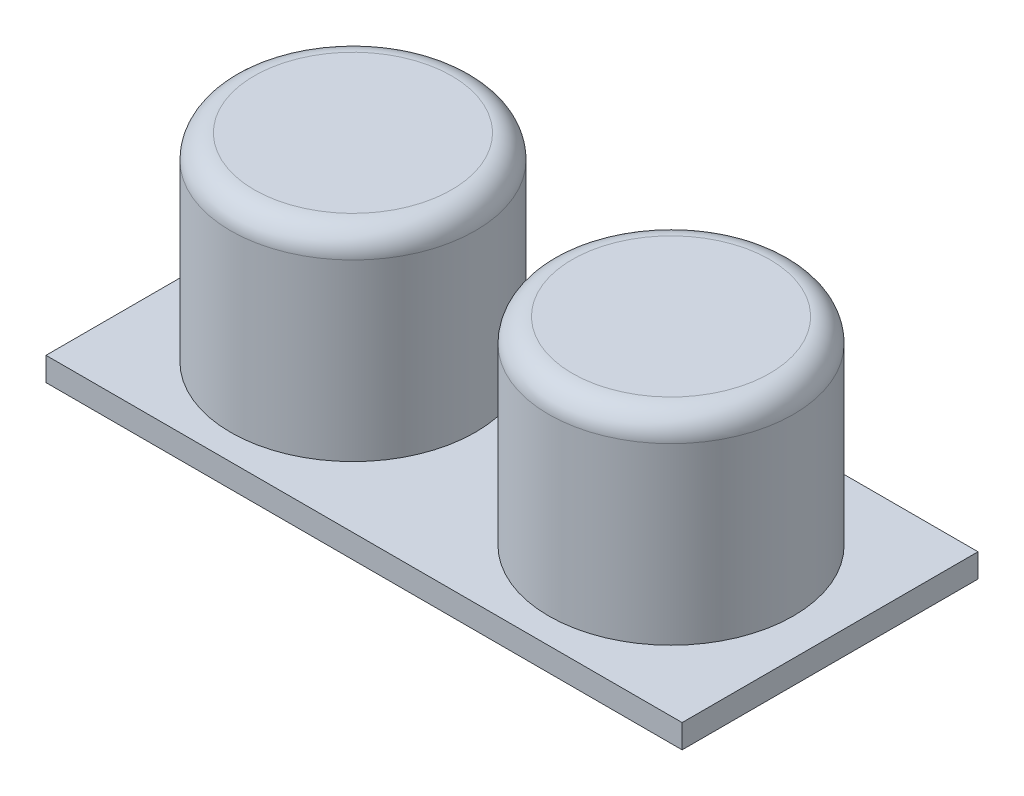
ISO-10303-21;
HEADER;
FILE_DESCRIPTION(('STEP AP214'),'2;1');
FILE_NAME('part.step','',(''),(''),'','','');
FILE_SCHEMA(('AUTOMOTIVE_DESIGN { 1 0 10303 214 1 1 1 1 }'));
ENDSEC;
DATA;
#1=APPLICATION_CONTEXT('core data for automotive mechanical design processes');
#2=APPLICATION_PROTOCOL_DEFINITION('international standard','automotive_design',2000,#1);
#3=PRODUCT_CONTEXT('',#1,'mechanical');
#4=PRODUCT('Part','Part','',(#3));
#5=PRODUCT_RELATED_PRODUCT_CATEGORY('part','',(#4));
#6=PRODUCT_DEFINITION_FORMATION('','',#4);
#7=PRODUCT_DEFINITION_CONTEXT('part definition',#1,'design');
#8=PRODUCT_DEFINITION('design','',#6,#7);
#9=PRODUCT_DEFINITION_SHAPE('','',#8);
#10=(LENGTH_UNIT() NAMED_UNIT(*) SI_UNIT(.MILLI.,.METRE.));
#11=(NAMED_UNIT(*) PLANE_ANGLE_UNIT() SI_UNIT($,.RADIAN.));
#12=(NAMED_UNIT(*) SI_UNIT($,.STERADIAN.) SOLID_ANGLE_UNIT());
#13=UNCERTAINTY_MEASURE_WITH_UNIT(LENGTH_MEASURE(1.E-05),#10,'distance_accuracy_value','');
#14=(GEOMETRIC_REPRESENTATION_CONTEXT(3) GLOBAL_UNCERTAINTY_ASSIGNED_CONTEXT((#13)) GLOBAL_UNIT_ASSIGNED_CONTEXT((#10,
#11,#12)) REPRESENTATION_CONTEXT('',''));
#15=CARTESIAN_POINT('',(0.,0.,0.));
#16=DIRECTION('',(0.,0.,1.));
#17=DIRECTION('',(1.,0.,0.));
#18=AXIS2_PLACEMENT_3D('',#15,#16,#17);
#19=CARTESIAN_POINT('',(0.,0.,0.));
#20=DIRECTION('',(0.,-1.,0.));
#21=DIRECTION('',(0.,0.,-1.));
#22=AXIS2_PLACEMENT_3D('',#19,#20,#21);
#23=PLANE('',#22);
#24=DIRECTION('',(-1.,0.,0.));
#25=VECTOR('',#24,1.);
#26=CARTESIAN_POINT('',(21.5,0.,10.));
#27=LINE('',#26,#25);
#28=CARTESIAN_POINT('',(21.5,0.,10.));
#29=VERTEX_POINT('',#28);
#30=CARTESIAN_POINT('',(-21.5,0.,10.));
#31=VERTEX_POINT('',#30);
#32=EDGE_CURVE('E122',#29,#31,#27,.T.);
#33=ORIENTED_EDGE('',*,*,#32,.T.);
#34=DIRECTION('',(0.,0.,-1.));
#35=VECTOR('',#34,1.);
#36=CARTESIAN_POINT('',(-21.5,0.,10.));
#37=LINE('',#36,#35);
#38=CARTESIAN_POINT('',(-21.5,0.,-10.));
#39=VERTEX_POINT('',#38);
#40=EDGE_CURVE('E125',#31,#39,#37,.T.);
#41=ORIENTED_EDGE('',*,*,#40,.T.);
#42=DIRECTION('',(-1.,0.,0.));
#43=VECTOR('',#42,1.);
#44=CARTESIAN_POINT('',(21.5,0.,-10.));
#45=LINE('',#44,#43);
#46=CARTESIAN_POINT('',(21.5,0.,-10.));
#47=VERTEX_POINT('',#46);
#48=EDGE_CURVE('E145',#47,#39,#45,.T.);
#49=ORIENTED_EDGE('',*,*,#48,.F.);
#50=DIRECTION('',(0.,0.,-1.));
#51=VECTOR('',#50,1.);
#52=CARTESIAN_POINT('',(21.5,0.,10.));
#53=LINE('',#52,#51);
#54=EDGE_CURVE('E135',#29,#47,#53,.T.);
#55=ORIENTED_EDGE('',*,*,#54,.F.);
#56=EDGE_LOOP('',(#33,#41,#49,#55));
#57=FACE_BOUND('',#56,.T.);
#58=DIRECTION('',(-1.,0.,0.));
#59=VECTOR('',#58,1.);
#60=CARTESIAN_POINT('',(3.81,0.,-7.3248809899986));
#61=LINE('',#60,#59);
#62=CARTESIAN_POINT('',(3.81,0.,-7.3248809899986));
#63=VERTEX_POINT('',#62);
#64=CARTESIAN_POINT('',(-6.35,0.,-7.3248809899986));
#65=VERTEX_POINT('',#64);
#66=EDGE_CURVE('E50',#63,#65,#61,.T.);
#67=ORIENTED_EDGE('',*,*,#66,.F.);
#68=DIRECTION('',(0.,0.,1.));
#69=VECTOR('',#68,1.);
#70=CARTESIAN_POINT('',(3.81,0.,-9.8648809899986));
#71=LINE('',#70,#69);
#72=CARTESIAN_POINT('',(3.81,0.,-9.8648809899986));
#73=VERTEX_POINT('',#72);
#74=EDGE_CURVE('E121',#73,#63,#71,.T.);
#75=ORIENTED_EDGE('',*,*,#74,.F.);
#76=DIRECTION('',(-1.,0.,0.));
#77=VECTOR('',#76,1.);
#78=CARTESIAN_POINT('',(3.81,0.,-9.8648809899986));
#79=LINE('',#78,#77);
#80=CARTESIAN_POINT('',(-6.35,0.,-9.86488098999861));
#81=VERTEX_POINT('',#80);
#82=EDGE_CURVE('E118',#73,#81,#79,.T.);
#83=ORIENTED_EDGE('',*,*,#82,.T.);
#84=DIRECTION('',(0.,0.,1.));
#85=VECTOR('',#84,1.);
#86=CARTESIAN_POINT('',(-6.35,0.,-9.86488098999861));
#87=LINE('',#86,#85);
#88=EDGE_CURVE('E55',#81,#65,#87,.T.);
#89=ORIENTED_EDGE('',*,*,#88,.T.);
#90=EDGE_LOOP('',(#67,#75,#83,#89));
#91=FACE_BOUND('',#90,.T.);
#92=ADVANCED_FACE('F35',(#57,#91),#23,.T.);
#93=CARTESIAN_POINT('',(21.5,1.6,10.));
#94=DIRECTION('',(0.,0.,1.));
#95=DIRECTION('',(1.,0.,0.));
#96=AXIS2_PLACEMENT_3D('',#93,#94,#95);
#97=PLANE('',#96);
#98=ORIENTED_EDGE('',*,*,#32,.F.);
#99=DIRECTION('',(0.,-1.,0.));
#100=VECTOR('',#99,1.);
#101=CARTESIAN_POINT('',(21.5,1.6,10.));
#102=LINE('',#101,#100);
#103=CARTESIAN_POINT('',(21.5,1.6,10.));
#104=VERTEX_POINT('',#103);
#105=EDGE_CURVE('E149',#104,#29,#102,.T.);
#106=ORIENTED_EDGE('',*,*,#105,.F.);
#107=DIRECTION('',(-1.,0.,0.));
#108=VECTOR('',#107,1.);
#109=CARTESIAN_POINT('',(21.5,1.6,10.));
#110=LINE('',#109,#108);
#111=CARTESIAN_POINT('',(-21.5,1.6,10.));
#112=VERTEX_POINT('',#111);
#113=EDGE_CURVE('E131',#104,#112,#110,.T.);
#114=ORIENTED_EDGE('',*,*,#113,.T.);
#115=DIRECTION('',(0.,-1.,0.));
#116=VECTOR('',#115,1.);
#117=CARTESIAN_POINT('',(-21.5,1.6,10.));
#118=LINE('',#117,#116);
#119=EDGE_CURVE('E141',#112,#31,#118,.T.);
#120=ORIENTED_EDGE('',*,*,#119,.T.);
#121=EDGE_LOOP('',(#98,#106,#114,#120));
#122=FACE_BOUND('',#121,.T.);
#123=ADVANCED_FACE('F184',(#122),#97,.T.);
#124=CARTESIAN_POINT('',(21.5,1.6,10.));
#125=DIRECTION('',(-1.,0.,0.));
#126=DIRECTION('',(0.,0.,1.));
#127=AXIS2_PLACEMENT_3D('',#124,#125,#126);
#128=PLANE('',#127);
#129=ORIENTED_EDGE('',*,*,#54,.T.);
#130=DIRECTION('',(0.,-1.,0.));
#131=VECTOR('',#130,1.);
#132=CARTESIAN_POINT('',(21.5,1.6,-10.));
#133=LINE('',#132,#131);
#134=CARTESIAN_POINT('',(21.5,1.6,-10.));
#135=VERTEX_POINT('',#134);
#136=EDGE_CURVE('E152',#135,#47,#133,.T.);
#137=ORIENTED_EDGE('',*,*,#136,.F.);
#138=DIRECTION('',(0.,0.,-1.));
#139=VECTOR('',#138,1.);
#140=CARTESIAN_POINT('',(21.5,1.6,10.));
#141=LINE('',#140,#139);
#142=EDGE_CURVE('E140',#104,#135,#141,.T.);
#143=ORIENTED_EDGE('',*,*,#142,.F.);
#144=ORIENTED_EDGE('',*,*,#105,.T.);
#145=EDGE_LOOP('',(#129,#137,#143,#144));
#146=FACE_BOUND('',#145,.T.);
#147=ADVANCED_FACE('F190',(#146),#128,.F.);
#148=CARTESIAN_POINT('',(21.5,1.6,-10.));
#149=DIRECTION('',(0.,0.,1.));
#150=DIRECTION('',(1.,0.,0.));
#151=AXIS2_PLACEMENT_3D('',#148,#149,#150);
#152=PLANE('',#151);
#153=ORIENTED_EDGE('',*,*,#48,.T.);
#154=DIRECTION('',(0.,-1.,0.));
#155=VECTOR('',#154,1.);
#156=CARTESIAN_POINT('',(-21.5,1.6,-10.));
#157=LINE('',#156,#155);
#158=CARTESIAN_POINT('',(-21.5,1.6,-10.));
#159=VERTEX_POINT('',#158);
#160=EDGE_CURVE('E155',#159,#39,#157,.T.);
#161=ORIENTED_EDGE('',*,*,#160,.F.);
#162=DIRECTION('',(-1.,0.,0.));
#163=VECTOR('',#162,1.);
#164=CARTESIAN_POINT('',(21.5,1.6,-10.));
#165=LINE('',#164,#163);
#166=EDGE_CURVE('E138',#135,#159,#165,.T.);
#167=ORIENTED_EDGE('',*,*,#166,.F.);
#168=ORIENTED_EDGE('',*,*,#136,.T.);
#169=EDGE_LOOP('',(#153,#161,#167,#168));
#170=FACE_BOUND('',#169,.T.);
#171=ADVANCED_FACE('F199',(#170),#152,.F.);
#172=CARTESIAN_POINT('',(-21.5,1.6,10.));
#173=DIRECTION('',(-1.,0.,0.));
#174=DIRECTION('',(0.,0.,1.));
#175=AXIS2_PLACEMENT_3D('',#172,#173,#174);
#176=PLANE('',#175);
#177=ORIENTED_EDGE('',*,*,#40,.F.);
#178=ORIENTED_EDGE('',*,*,#119,.F.);
#179=DIRECTION('',(0.,0.,-1.));
#180=VECTOR('',#179,1.);
#181=CARTESIAN_POINT('',(-21.5,1.6,10.));
#182=LINE('',#181,#180);
#183=EDGE_CURVE('E134',#112,#159,#182,.T.);
#184=ORIENTED_EDGE('',*,*,#183,.T.);
#185=ORIENTED_EDGE('',*,*,#160,.T.);
#186=EDGE_LOOP('',(#177,#178,#184,#185));
#187=FACE_BOUND('',#186,.T.);
#188=ADVANCED_FACE('F203',(#187),#176,.T.);
#189=CARTESIAN_POINT('',(0.,1.6,0.));
#190=DIRECTION('',(0.,-1.,0.));
#191=DIRECTION('',(0.,0.,-1.));
#192=AXIS2_PLACEMENT_3D('',#189,#190,#191);
#193=PLANE('',#192);
#194=CARTESIAN_POINT('',(10.75,1.6,0.));
#195=DIRECTION('',(0.,-1.,0.));
#196=DIRECTION('',(0.,0.,-1.));
#197=AXIS2_PLACEMENT_3D('',#194,#195,#196);
#198=CIRCLE('',#197,8.27293005142715);
#199=CARTESIAN_POINT('',(10.75,1.6,-8.27293005142715));
#200=VERTEX_POINT('',#199);
#201=EDGE_CURVE('E160',#200,#200,#198,.F.);
#202=ORIENTED_EDGE('',*,*,#201,.F.);
#203=EDGE_LOOP('',(#202));
#204=FACE_BOUND('',#203,.T.);
#205=CARTESIAN_POINT('',(-10.75,1.6,0.));
#206=DIRECTION('',(0.,-1.,0.));
#207=DIRECTION('',(0.,0.,-1.));
#208=AXIS2_PLACEMENT_3D('',#205,#206,#207);
#209=CIRCLE('',#208,8.27293005142715);
#210=CARTESIAN_POINT('',(-10.75,1.6,-8.27293005142715));
#211=VERTEX_POINT('',#210);
#212=EDGE_CURVE('E151',#211,#211,#209,.F.);
#213=ORIENTED_EDGE('',*,*,#212,.F.);
#214=EDGE_LOOP('',(#213));
#215=FACE_BOUND('',#214,.T.);
#216=ORIENTED_EDGE('',*,*,#113,.F.);
#217=ORIENTED_EDGE('',*,*,#142,.T.);
#218=ORIENTED_EDGE('',*,*,#166,.T.);
#219=ORIENTED_EDGE('',*,*,#183,.F.);
#220=EDGE_LOOP('',(#216,#217,#218,#219));
#221=FACE_BOUND('',#220,.T.);
#222=ADVANCED_FACE('F195',(#204,#215,#221),#193,.F.);
#223=CARTESIAN_POINT('',(-10.75,15.,0.));
#224=DIRECTION('',(0.,-1.,0.));
#225=DIRECTION('',(0.,0.,-1.));
#226=AXIS2_PLACEMENT_3D('',#223,#224,#225);
#227=CYLINDRICAL_SURFACE('',#226,8.27293005142715);
#228=CARTESIAN_POINT('',(-10.75,13.4,0.));
#229=DIRECTION('',(0.,1.,0.));
#230=DIRECTION('',(0.,0.,1.));
#231=AXIS2_PLACEMENT_3D('',#228,#229,#230);
#232=CIRCLE('',#231,8.27293005142715);
#233=CARTESIAN_POINT('',(-10.75,13.4,8.27293005142715));
#234=VERTEX_POINT('',#233);
#235=EDGE_CURVE('E166',#234,#234,#232,.F.);
#236=ORIENTED_EDGE('',*,*,#235,.T.);
#237=EDGE_LOOP('',(#236));
#238=FACE_BOUND('',#237,.T.);
#239=ORIENTED_EDGE('',*,*,#212,.T.);
#240=EDGE_LOOP('',(#239));
#241=FACE_BOUND('',#240,.T.);
#242=ADVANCED_FACE('F210',(#238,#241),#227,.T.);
#243=CARTESIAN_POINT('',(-10.75,15.,0.));
#244=DIRECTION('',(0.,1.,0.));
#245=DIRECTION('',(0.,0.,1.));
#246=AXIS2_PLACEMENT_3D('',#243,#244,#245);
#247=PLANE('',#246);
#248=CARTESIAN_POINT('',(-10.75,15.,0.));
#249=DIRECTION('',(0.,1.,0.));
#250=DIRECTION('',(0.,0.,1.));
#251=AXIS2_PLACEMENT_3D('',#248,#249,#250);
#252=CIRCLE('',#251,6.67293005142715);
#253=CARTESIAN_POINT('',(-10.75,15.,6.67293005142715));
#254=VERTEX_POINT('',#253);
#255=EDGE_CURVE('E163',#254,#254,#252,.T.);
#256=ORIENTED_EDGE('',*,*,#255,.T.);
#257=EDGE_LOOP('',(#256));
#258=FACE_BOUND('',#257,.T.);
#259=ADVANCED_FACE('F226',(#258),#247,.T.);
#260=CARTESIAN_POINT('',(10.75,15.,0.));
#261=DIRECTION('',(0.,-1.,0.));
#262=DIRECTION('',(0.,0.,-1.));
#263=AXIS2_PLACEMENT_3D('',#260,#261,#262);
#264=CYLINDRICAL_SURFACE('',#263,8.27293005142715);
#265=CARTESIAN_POINT('',(10.75,13.4,0.));
#266=DIRECTION('',(0.,-1.,0.));
#267=DIRECTION('',(0.,0.,-1.));
#268=AXIS2_PLACEMENT_3D('',#265,#266,#267);
#269=CIRCLE('',#268,8.27293005142715);
#270=CARTESIAN_POINT('',(10.75,13.4,-8.27293005142715));
#271=VERTEX_POINT('',#270);
#272=EDGE_CURVE('E11',#271,#271,#269,.T.);
#273=ORIENTED_EDGE('',*,*,#272,.T.);
#274=EDGE_LOOP('',(#273));
#275=FACE_BOUND('',#274,.T.);
#276=ORIENTED_EDGE('',*,*,#201,.T.);
#277=EDGE_LOOP('',(#276));
#278=FACE_BOUND('',#277,.T.);
#279=ADVANCED_FACE('F233',(#275,#278),#264,.T.);
#280=CARTESIAN_POINT('',(10.75,15.,0.));
#281=DIRECTION('',(0.,-1.,0.));
#282=DIRECTION('',(0.,0.,-1.));
#283=AXIS2_PLACEMENT_3D('',#280,#281,#282);
#284=PLANE('',#283);
#285=CARTESIAN_POINT('',(10.75,15.,0.));
#286=DIRECTION('',(0.,-1.,0.));
#287=DIRECTION('',(0.,0.,-1.));
#288=AXIS2_PLACEMENT_3D('',#285,#286,#287);
#289=CIRCLE('',#288,6.67293005142715);
#290=CARTESIAN_POINT('',(10.75,15.,-6.67293005142715));
#291=VERTEX_POINT('',#290);
#292=EDGE_CURVE('E43',#291,#291,#289,.F.);
#293=ORIENTED_EDGE('',*,*,#292,.T.);
#294=EDGE_LOOP('',(#293));
#295=FACE_BOUND('',#294,.T.);
#296=ADVANCED_FACE('F171',(#295),#284,.F.);
#297=CARTESIAN_POINT('',(-10.75,13.4,0.));
#298=DIRECTION('',(0.,1.,0.));
#299=DIRECTION('',(0.,0.,1.));
#300=AXIS2_PLACEMENT_3D('',#297,#298,#299);
#301=TOROIDAL_SURFACE('',#300,6.67293005142715,1.6);
#302=ORIENTED_EDGE('',*,*,#235,.F.);
#303=EDGE_LOOP('',(#302));
#304=FACE_BOUND('',#303,.T.);
#305=ORIENTED_EDGE('',*,*,#255,.F.);
#306=EDGE_LOOP('',(#305));
#307=FACE_BOUND('',#306,.T.);
#308=ADVANCED_FACE('F174',(#304,#307),#301,.T.);
#309=CARTESIAN_POINT('',(10.75,13.4,0.));
#310=DIRECTION('',(0.,-1.,0.));
#311=DIRECTION('',(0.,0.,-1.));
#312=AXIS2_PLACEMENT_3D('',#309,#310,#311);
#313=TOROIDAL_SURFACE('',#312,6.67293005142715,1.6);
#314=ORIENTED_EDGE('',*,*,#272,.F.);
#315=EDGE_LOOP('',(#314));
#316=FACE_BOUND('',#315,.T.);
#317=ORIENTED_EDGE('',*,*,#292,.F.);
#318=EDGE_LOOP('',(#317));
#319=FACE_BOUND('',#318,.T.);
#320=ADVANCED_FACE('F37',(#316,#319),#313,.T.);
#321=CARTESIAN_POINT('',(3.81,-1.6,-9.8648809899986));
#322=DIRECTION('',(-1.,0.,0.));
#323=DIRECTION('',(0.,0.,1.));
#324=AXIS2_PLACEMENT_3D('',#321,#322,#323);
#325=PLANE('',#324);
#326=ORIENTED_EDGE('',*,*,#74,.T.);
#327=DIRECTION('',(0.,1.,0.));
#328=VECTOR('',#327,1.);
#329=CARTESIAN_POINT('',(3.81,-1.6,-7.3248809899986));
#330=LINE('',#329,#328);
#331=CARTESIAN_POINT('',(3.81,-1.6,-7.3248809899986));
#332=VERTEX_POINT('',#331);
#333=EDGE_CURVE('E102',#332,#63,#330,.T.);
#334=ORIENTED_EDGE('',*,*,#333,.F.);
#335=DIRECTION('',(0.,0.,1.));
#336=VECTOR('',#335,1.);
#337=CARTESIAN_POINT('',(3.81,-1.6,-9.8648809899986));
#338=LINE('',#337,#336);
#339=CARTESIAN_POINT('',(3.81,-1.6,-9.8648809899986));
#340=VERTEX_POINT('',#339);
#341=EDGE_CURVE('E109',#340,#332,#338,.T.);
#342=ORIENTED_EDGE('',*,*,#341,.F.);
#343=DIRECTION('',(0.,1.,0.));
#344=VECTOR('',#343,1.);
#345=CARTESIAN_POINT('',(3.81,-1.6,-9.8648809899986));
#346=LINE('',#345,#344);
#347=EDGE_CURVE('E350',#340,#73,#346,.T.);
#348=ORIENTED_EDGE('',*,*,#347,.T.);
#349=EDGE_LOOP('',(#326,#334,#342,#348));
#350=FACE_BOUND('',#349,.T.);
#351=ADVANCED_FACE('F120',(#350),#325,.F.);
#352=CARTESIAN_POINT('',(3.81,-1.6,-7.3248809899986));
#353=DIRECTION('',(0.,0.,-1.));
#354=DIRECTION('',(-1.,0.,0.));
#355=AXIS2_PLACEMENT_3D('',#352,#353,#354);
#356=PLANE('',#355);
#357=ORIENTED_EDGE('',*,*,#66,.T.);
#358=DIRECTION('',(0.,1.,0.));
#359=VECTOR('',#358,1.);
#360=CARTESIAN_POINT('',(-6.35,-1.6,-7.3248809899986));
#361=LINE('',#360,#359);
#362=CARTESIAN_POINT('',(-6.35,-1.6,-7.3248809899986));
#363=VERTEX_POINT('',#362);
#364=EDGE_CURVE('E104',#363,#65,#361,.T.);
#365=ORIENTED_EDGE('',*,*,#364,.F.);
#366=DIRECTION('',(-1.,0.,0.));
#367=VECTOR('',#366,1.);
#368=CARTESIAN_POINT('',(3.81,-1.6,-7.3248809899986));
#369=LINE('',#368,#367);
#370=EDGE_CURVE('E98',#332,#363,#369,.T.);
#371=ORIENTED_EDGE('',*,*,#370,.F.);
#372=ORIENTED_EDGE('',*,*,#333,.T.);
#373=EDGE_LOOP('',(#357,#365,#371,#372));
#374=FACE_BOUND('',#373,.T.);
#375=ADVANCED_FACE('F100',(#374),#356,.F.);
#376=CARTESIAN_POINT('',(-6.35,-1.6,-9.86488098999861));
#377=DIRECTION('',(-1.,0.,0.));
#378=DIRECTION('',(0.,0.,1.));
#379=AXIS2_PLACEMENT_3D('',#376,#377,#378);
#380=PLANE('',#379);
#381=ORIENTED_EDGE('',*,*,#88,.F.);
#382=DIRECTION('',(0.,1.,0.));
#383=VECTOR('',#382,1.);
#384=CARTESIAN_POINT('',(-6.35,-1.6,-9.86488098999861));
#385=LINE('',#384,#383);
#386=CARTESIAN_POINT('',(-6.35,-1.6,-9.86488098999861));
#387=VERTEX_POINT('',#386);
#388=EDGE_CURVE('E127',#387,#81,#385,.T.);
#389=ORIENTED_EDGE('',*,*,#388,.F.);
#390=DIRECTION('',(0.,0.,1.));
#391=VECTOR('',#390,1.);
#392=CARTESIAN_POINT('',(-6.35,-1.6,-9.86488098999861));
#393=LINE('',#392,#391);
#394=EDGE_CURVE('E108',#387,#363,#393,.T.);
#395=ORIENTED_EDGE('',*,*,#394,.T.);
#396=ORIENTED_EDGE('',*,*,#364,.T.);
#397=EDGE_LOOP('',(#381,#389,#395,#396));
#398=FACE_BOUND('',#397,.T.);
#399=ADVANCED_FACE('F247',(#398),#380,.T.);
#400=CARTESIAN_POINT('',(3.81,-1.6,-9.8648809899986));
#401=DIRECTION('',(0.,0.,-1.));
#402=DIRECTION('',(-1.,0.,0.));
#403=AXIS2_PLACEMENT_3D('',#400,#401,#402);
#404=PLANE('',#403);
#405=ORIENTED_EDGE('',*,*,#82,.F.);
#406=ORIENTED_EDGE('',*,*,#347,.F.);
#407=DIRECTION('',(-1.,0.,0.));
#408=VECTOR('',#407,1.);
#409=CARTESIAN_POINT('',(3.81,-1.6,-9.8648809899986));
#410=LINE('',#409,#408);
#411=EDGE_CURVE('E115',#340,#387,#410,.T.);
#412=ORIENTED_EDGE('',*,*,#411,.T.);
#413=ORIENTED_EDGE('',*,*,#388,.T.);
#414=EDGE_LOOP('',(#405,#406,#412,#413));
#415=FACE_BOUND('',#414,.T.);
#416=ADVANCED_FACE('F250',(#415),#404,.T.);
#417=CARTESIAN_POINT('',(0.,-1.6,0.));
#418=DIRECTION('',(0.,-1.,0.));
#419=DIRECTION('',(0.,0.,-1.));
#420=AXIS2_PLACEMENT_3D('',#417,#418,#419);
#421=PLANE('',#420);
#422=ORIENTED_EDGE('',*,*,#341,.T.);
#423=ORIENTED_EDGE('',*,*,#370,.T.);
#424=ORIENTED_EDGE('',*,*,#394,.F.);
#425=ORIENTED_EDGE('',*,*,#411,.F.);
#426=EDGE_LOOP('',(#422,#423,#424,#425));
#427=FACE_BOUND('',#426,.T.);
#428=ADVANCED_FACE('F113',(#427),#421,.T.);
#429=CLOSED_SHELL('',(#92,#123,#147,#171,#188,#222,#242,#259,#279,#296,#308,#320,#351,#375,#399,
#416,#428));
#430=MANIFOLD_SOLID_BREP('B2',#429);
#431=ADVANCED_BREP_SHAPE_REPRESENTATION('',(#18,#430),#14);
#432=SHAPE_DEFINITION_REPRESENTATION(#9,#431);
ENDSEC;
END-ISO-10303-21;
